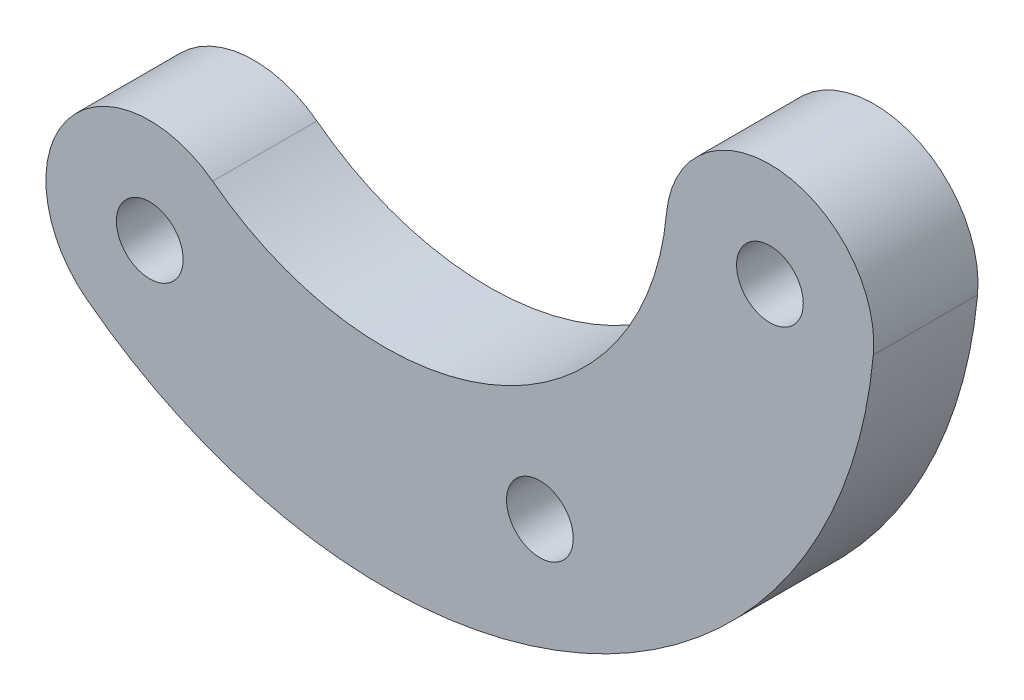
ISO-10303-21;
HEADER;
FILE_DESCRIPTION(('STEP AP214'),'2;1');
FILE_NAME('part.step','',(''),(''),'','','');
FILE_SCHEMA(('AUTOMOTIVE_DESIGN { 1 0 10303 214 1 1 1 1 }'));
ENDSEC;
DATA;
#1=APPLICATION_CONTEXT('core data for automotive mechanical design processes');
#2=APPLICATION_PROTOCOL_DEFINITION('international standard','automotive_design',2000,#1);
#3=PRODUCT_CONTEXT('',#1,'mechanical');
#4=PRODUCT('Part','Part','',(#3));
#5=PRODUCT_RELATED_PRODUCT_CATEGORY('part','',(#4));
#6=PRODUCT_DEFINITION_FORMATION('','',#4);
#7=PRODUCT_DEFINITION_CONTEXT('part definition',#1,'design');
#8=PRODUCT_DEFINITION('design','',#6,#7);
#9=PRODUCT_DEFINITION_SHAPE('','',#8);
#10=(LENGTH_UNIT() NAMED_UNIT(*) SI_UNIT(.MILLI.,.METRE.));
#11=(NAMED_UNIT(*) PLANE_ANGLE_UNIT() SI_UNIT($,.RADIAN.));
#12=(NAMED_UNIT(*) SI_UNIT($,.STERADIAN.) SOLID_ANGLE_UNIT());
#13=UNCERTAINTY_MEASURE_WITH_UNIT(LENGTH_MEASURE(1.E-05),#10,'distance_accuracy_value','');
#14=(GEOMETRIC_REPRESENTATION_CONTEXT(3) GLOBAL_UNCERTAINTY_ASSIGNED_CONTEXT((#13)) GLOBAL_UNIT_ASSIGNED_CONTEXT((#10,
#11,#12)) REPRESENTATION_CONTEXT('',''));
#15=CARTESIAN_POINT('',(0.,0.,0.));
#16=DIRECTION('',(0.,0.,1.));
#17=DIRECTION('',(1.,0.,0.));
#18=AXIS2_PLACEMENT_3D('',#15,#16,#17);
#19=CARTESIAN_POINT('',(5.62372279213482,7.39073384122035,5.));
#20=DIRECTION('',(0.,0.,1.));
#21=DIRECTION('',(1.,0.,0.));
#22=AXIS2_PLACEMENT_3D('',#19,#20,#21);
#23=PLANE('',#22);
#24=CARTESIAN_POINT('',(29.7405651254805,13.0490275961371,5.));
#25=DIRECTION('',(0.,0.,1.));
#26=DIRECTION('',(1.,0.,0.));
#27=AXIS2_PLACEMENT_3D('',#24,#25,#26);
#28=CIRCLE('',#27,1.6);
#29=CARTESIAN_POINT('',(31.3405651254805,13.0490275961371,5.));
#30=VERTEX_POINT('',#29);
#31=EDGE_CURVE('E119',#30,#30,#28,.T.);
#32=ORIENTED_EDGE('',*,*,#31,.F.);
#33=EDGE_LOOP('',(#32));
#34=FACE_BOUND('',#33,.T.);
#35=CARTESIAN_POINT('',(0.,0.,5.));
#36=DIRECTION('',(0.,0.,1.));
#37=DIRECTION('',(1.,0.,0.));
#38=AXIS2_PLACEMENT_3D('',#35,#36,#37);
#39=CIRCLE('',#38,4.98064728563962);
#40=CARTESIAN_POINT('',(3.01600559407415,3.96365458137595,5.));
#41=VERTEX_POINT('',#40);
#42=CARTESIAN_POINT('',(-3.01600559407414,-3.96365458137601,5.));
#43=VERTEX_POINT('',#42);
#44=EDGE_CURVE('E89',#41,#43,#39,.T.);
#45=ORIENTED_EDGE('',*,*,#44,.T.);
#46=CARTESIAN_POINT('',(11.2474455842696,14.7814676824407,5.));
#47=DIRECTION('',(0.,0.,1.));
#48=DIRECTION('',(1.,0.,0.));
#49=AXIS2_PLACEMENT_3D('',#46,#47,#48);
#50=CIRCLE('',#49,23.5547372772959);
#51=CARTESIAN_POINT('',(34.6995001627995,12.5844733155636,5.));
#52=VERTEX_POINT('',#51);
#53=EDGE_CURVE('E84',#43,#52,#50,.T.);
#54=ORIENTED_EDGE('',*,*,#53,.T.);
#55=CARTESIAN_POINT('',(29.7405651254805,13.0490275961371,5.));
#56=DIRECTION('',(0.,0.,1.));
#57=DIRECTION('',(1.,0.,0.));
#58=AXIS2_PLACEMENT_3D('',#55,#56,#57);
#59=CIRCLE('',#58,4.98064728563963);
#60=CARTESIAN_POINT('',(24.7816300881615,13.5135818767106,5.));
#61=VERTEX_POINT('',#60);
#62=EDGE_CURVE('E87',#52,#61,#59,.T.);
#63=ORIENTED_EDGE('',*,*,#62,.T.);
#64=CARTESIAN_POINT('',(11.2474455842696,14.7814676824407,5.));
#65=DIRECTION('',(0.,0.,-1.));
#66=DIRECTION('',(1.,0.,0.));
#67=AXIS2_PLACEMENT_3D('',#64,#65,#66);
#68=CIRCLE('',#67,13.5934427060167);
#69=EDGE_CURVE('E54',#61,#41,#68,.T.);
#70=ORIENTED_EDGE('',*,*,#69,.T.);
#71=EDGE_LOOP('',(#45,#54,#63,#70));
#72=FACE_BOUND('',#71,.T.);
#73=CARTESIAN_POINT('',(0.,0.,5.));
#74=DIRECTION('',(0.,0.,1.));
#75=DIRECTION('',(1.,0.,0.));
#76=AXIS2_PLACEMENT_3D('',#73,#74,#75);
#77=CIRCLE('',#76,1.6);
#78=CARTESIAN_POINT('',(1.60000000000001,0.,5.));
#79=VERTEX_POINT('',#78);
#80=EDGE_CURVE('E104',#79,#79,#77,.T.);
#81=ORIENTED_EDGE('',*,*,#80,.F.);
#82=EDGE_LOOP('',(#81));
#83=FACE_BOUND('',#82,.T.);
#84=CARTESIAN_POINT('',(18.7103021468575,-2.22742972286997,5.));
#85=DIRECTION('',(0.,0.,1.));
#86=DIRECTION('',(1.,0.,0.));
#87=AXIS2_PLACEMENT_3D('',#84,#85,#86);
#88=CIRCLE('',#87,1.6);
#89=CARTESIAN_POINT('',(20.3103021468575,-2.22742972286997,5.));
#90=VERTEX_POINT('',#89);
#91=EDGE_CURVE('E125',#90,#90,#88,.T.);
#92=ORIENTED_EDGE('',*,*,#91,.F.);
#93=EDGE_LOOP('',(#92));
#94=FACE_BOUND('',#93,.T.);
#95=ADVANCED_FACE('F37',(#34,#72,#83,#94),#23,.T.);
#96=CARTESIAN_POINT('',(5.62372279213482,7.39073384122035,0.));
#97=DIRECTION('',(0.,0.,1.));
#98=DIRECTION('',(1.,0.,0.));
#99=AXIS2_PLACEMENT_3D('',#96,#97,#98);
#100=PLANE('',#99);
#101=CARTESIAN_POINT('',(0.,0.,0.));
#102=DIRECTION('',(0.,0.,1.));
#103=DIRECTION('',(1.,0.,0.));
#104=AXIS2_PLACEMENT_3D('',#101,#102,#103);
#105=CIRCLE('',#104,4.98064728563962);
#106=CARTESIAN_POINT('',(3.01600559407415,3.96365458137595,0.));
#107=VERTEX_POINT('',#106);
#108=CARTESIAN_POINT('',(-3.01600559407414,-3.96365458137601,0.));
#109=VERTEX_POINT('',#108);
#110=EDGE_CURVE('E101',#107,#109,#105,.T.);
#111=ORIENTED_EDGE('',*,*,#110,.F.);
#112=CARTESIAN_POINT('',(11.2474455842696,14.7814676824407,0.));
#113=DIRECTION('',(0.,0.,-1.));
#114=DIRECTION('',(1.,0.,0.));
#115=AXIS2_PLACEMENT_3D('',#112,#113,#114);
#116=CIRCLE('',#115,13.5934427060167);
#117=CARTESIAN_POINT('',(24.7816300881615,13.5135818767106,0.));
#118=VERTEX_POINT('',#117);
#119=EDGE_CURVE('E77',#118,#107,#116,.T.);
#120=ORIENTED_EDGE('',*,*,#119,.F.);
#121=CARTESIAN_POINT('',(29.7405651254805,13.0490275961371,0.));
#122=DIRECTION('',(0.,0.,1.));
#123=DIRECTION('',(1.,0.,0.));
#124=AXIS2_PLACEMENT_3D('',#121,#122,#123);
#125=CIRCLE('',#124,4.98064728563963);
#126=CARTESIAN_POINT('',(34.6995001627995,12.5844733155636,0.));
#127=VERTEX_POINT('',#126);
#128=EDGE_CURVE('E71',#127,#118,#125,.T.);
#129=ORIENTED_EDGE('',*,*,#128,.F.);
#130=CARTESIAN_POINT('',(11.2474455842696,14.7814676824407,0.));
#131=DIRECTION('',(0.,0.,1.));
#132=DIRECTION('',(1.,0.,0.));
#133=AXIS2_PLACEMENT_3D('',#130,#131,#132);
#134=CIRCLE('',#133,23.5547372772959);
#135=EDGE_CURVE('E93',#109,#127,#134,.T.);
#136=ORIENTED_EDGE('',*,*,#135,.F.);
#137=EDGE_LOOP('',(#111,#120,#129,#136));
#138=FACE_BOUND('',#137,.T.);
#139=CARTESIAN_POINT('',(0.,0.,0.));
#140=DIRECTION('',(0.,0.,1.));
#141=DIRECTION('',(1.,0.,0.));
#142=AXIS2_PLACEMENT_3D('',#139,#140,#141);
#143=CIRCLE('',#142,1.6);
#144=CARTESIAN_POINT('',(1.60000000000001,0.,0.));
#145=VERTEX_POINT('',#144);
#146=EDGE_CURVE('E116',#145,#145,#143,.T.);
#147=ORIENTED_EDGE('',*,*,#146,.T.);
#148=EDGE_LOOP('',(#147));
#149=FACE_BOUND('',#148,.T.);
#150=CARTESIAN_POINT('',(29.7405651254805,13.0490275961371,0.));
#151=DIRECTION('',(0.,0.,1.));
#152=DIRECTION('',(1.,0.,0.));
#153=AXIS2_PLACEMENT_3D('',#150,#151,#152);
#154=CIRCLE('',#153,1.6);
#155=CARTESIAN_POINT('',(31.3405651254805,13.0490275961371,0.));
#156=VERTEX_POINT('',#155);
#157=EDGE_CURVE('E122',#156,#156,#154,.T.);
#158=ORIENTED_EDGE('',*,*,#157,.T.);
#159=EDGE_LOOP('',(#158));
#160=FACE_BOUND('',#159,.T.);
#161=CARTESIAN_POINT('',(18.7103021468575,-2.22742972286997,0.));
#162=DIRECTION('',(0.,0.,1.));
#163=DIRECTION('',(1.,0.,0.));
#164=AXIS2_PLACEMENT_3D('',#161,#162,#163);
#165=CIRCLE('',#164,1.6);
#166=CARTESIAN_POINT('',(20.3103021468575,-2.22742972286997,0.));
#167=VERTEX_POINT('',#166);
#168=EDGE_CURVE('E128',#167,#167,#165,.T.);
#169=ORIENTED_EDGE('',*,*,#168,.T.);
#170=EDGE_LOOP('',(#169));
#171=FACE_BOUND('',#170,.T.);
#172=ADVANCED_FACE('F112',(#138,#149,#160,#171),#100,.F.);
#173=CARTESIAN_POINT('',(0.,0.,5.));
#174=DIRECTION('',(0.,0.,-1.));
#175=DIRECTION('',(-1.,0.,0.));
#176=AXIS2_PLACEMENT_3D('',#173,#174,#175);
#177=CYLINDRICAL_SURFACE('',#176,4.98064728563962);
#178=ORIENTED_EDGE('',*,*,#110,.T.);
#179=DIRECTION('',(0.,0.,-1.));
#180=VECTOR('',#179,1.);
#181=CARTESIAN_POINT('',(-3.01600559407414,-3.96365458137601,5.));
#182=LINE('',#181,#180);
#183=EDGE_CURVE('E11',#43,#109,#182,.T.);
#184=ORIENTED_EDGE('',*,*,#183,.F.);
#185=ORIENTED_EDGE('',*,*,#44,.F.);
#186=DIRECTION('',(0.,0.,-1.));
#187=VECTOR('',#186,1.);
#188=CARTESIAN_POINT('',(3.01600559407415,3.96365458137595,5.));
#189=LINE('',#188,#187);
#190=EDGE_CURVE('E97',#41,#107,#189,.T.);
#191=ORIENTED_EDGE('',*,*,#190,.T.);
#192=EDGE_LOOP('',(#178,#184,#185,#191));
#193=FACE_BOUND('',#192,.T.);
#194=ADVANCED_FACE('F39',(#193),#177,.T.);
#195=CARTESIAN_POINT('',(11.2474455842696,14.7814676824407,5.));
#196=DIRECTION('',(0.,0.,-1.));
#197=DIRECTION('',(-1.,0.,0.));
#198=AXIS2_PLACEMENT_3D('',#195,#196,#197);
#199=CYLINDRICAL_SURFACE('',#198,23.5547372772959);
#200=ORIENTED_EDGE('',*,*,#135,.T.);
#201=DIRECTION('',(0.,0.,-1.));
#202=VECTOR('',#201,1.);
#203=CARTESIAN_POINT('',(34.6995001627995,12.5844733155636,5.));
#204=LINE('',#203,#202);
#205=EDGE_CURVE('E46',#52,#127,#204,.T.);
#206=ORIENTED_EDGE('',*,*,#205,.F.);
#207=ORIENTED_EDGE('',*,*,#53,.F.);
#208=ORIENTED_EDGE('',*,*,#183,.T.);
#209=EDGE_LOOP('',(#200,#206,#207,#208));
#210=FACE_BOUND('',#209,.T.);
#211=ADVANCED_FACE('F92',(#210),#199,.T.);
#212=CARTESIAN_POINT('',(29.7405651254805,13.0490275961371,5.));
#213=DIRECTION('',(0.,0.,-1.));
#214=DIRECTION('',(-1.,0.,0.));
#215=AXIS2_PLACEMENT_3D('',#212,#213,#214);
#216=CYLINDRICAL_SURFACE('',#215,4.98064728563963);
#217=ORIENTED_EDGE('',*,*,#128,.T.);
#218=DIRECTION('',(0.,0.,-1.));
#219=VECTOR('',#218,1.);
#220=CARTESIAN_POINT('',(24.7816300881615,13.5135818767106,5.));
#221=LINE('',#220,#219);
#222=EDGE_CURVE('E94',#61,#118,#221,.T.);
#223=ORIENTED_EDGE('',*,*,#222,.F.);
#224=ORIENTED_EDGE('',*,*,#62,.F.);
#225=ORIENTED_EDGE('',*,*,#205,.T.);
#226=EDGE_LOOP('',(#217,#223,#224,#225));
#227=FACE_BOUND('',#226,.T.);
#228=ADVANCED_FACE('F95',(#227),#216,.T.);
#229=CARTESIAN_POINT('',(11.2474455842696,14.7814676824407,5.));
#230=DIRECTION('',(0.,0.,-1.));
#231=DIRECTION('',(-1.,0.,0.));
#232=AXIS2_PLACEMENT_3D('',#229,#230,#231);
#233=CYLINDRICAL_SURFACE('',#232,13.5934427060167);
#234=ORIENTED_EDGE('',*,*,#119,.T.);
#235=ORIENTED_EDGE('',*,*,#190,.F.);
#236=ORIENTED_EDGE('',*,*,#69,.F.);
#237=ORIENTED_EDGE('',*,*,#222,.T.);
#238=EDGE_LOOP('',(#234,#235,#236,#237));
#239=FACE_BOUND('',#238,.T.);
#240=ADVANCED_FACE('F109',(#239),#233,.F.);
#241=CARTESIAN_POINT('',(0.,0.,5.));
#242=DIRECTION('',(0.,0.,-1.));
#243=DIRECTION('',(-1.,0.,0.));
#244=AXIS2_PLACEMENT_3D('',#241,#242,#243);
#245=CYLINDRICAL_SURFACE('',#244,1.6);
#246=ORIENTED_EDGE('',*,*,#80,.T.);
#247=EDGE_LOOP('',(#246));
#248=FACE_BOUND('',#247,.T.);
#249=ORIENTED_EDGE('',*,*,#146,.F.);
#250=EDGE_LOOP('',(#249));
#251=FACE_BOUND('',#250,.T.);
#252=ADVANCED_FACE('F146',(#248,#251),#245,.F.);
#253=CARTESIAN_POINT('',(29.7405651254805,13.0490275961371,5.));
#254=DIRECTION('',(0.,0.,-1.));
#255=DIRECTION('',(-1.,0.,0.));
#256=AXIS2_PLACEMENT_3D('',#253,#254,#255);
#257=CYLINDRICAL_SURFACE('',#256,1.6);
#258=ORIENTED_EDGE('',*,*,#31,.T.);
#259=EDGE_LOOP('',(#258));
#260=FACE_BOUND('',#259,.T.);
#261=ORIENTED_EDGE('',*,*,#157,.F.);
#262=EDGE_LOOP('',(#261));
#263=FACE_BOUND('',#262,.T.);
#264=ADVANCED_FACE('F192',(#260,#263),#257,.F.);
#265=CARTESIAN_POINT('',(18.7103021468575,-2.22742972286997,5.));
#266=DIRECTION('',(0.,0.,-1.));
#267=DIRECTION('',(-1.,0.,0.));
#268=AXIS2_PLACEMENT_3D('',#265,#266,#267);
#269=CYLINDRICAL_SURFACE('',#268,1.6);
#270=ORIENTED_EDGE('',*,*,#91,.T.);
#271=EDGE_LOOP('',(#270));
#272=FACE_BOUND('',#271,.T.);
#273=ORIENTED_EDGE('',*,*,#168,.F.);
#274=EDGE_LOOP('',(#273));
#275=FACE_BOUND('',#274,.T.);
#276=ADVANCED_FACE('F134',(#272,#275),#269,.F.);
#277=CLOSED_SHELL('',(#95,#172,#194,#211,#228,#240,#252,#264,#276));
#278=MANIFOLD_SOLID_BREP('B2',#277);
#279=ADVANCED_BREP_SHAPE_REPRESENTATION('',(#18,#278),#14);
#280=SHAPE_DEFINITION_REPRESENTATION(#9,#279);
ENDSEC;
END-ISO-10303-21;
